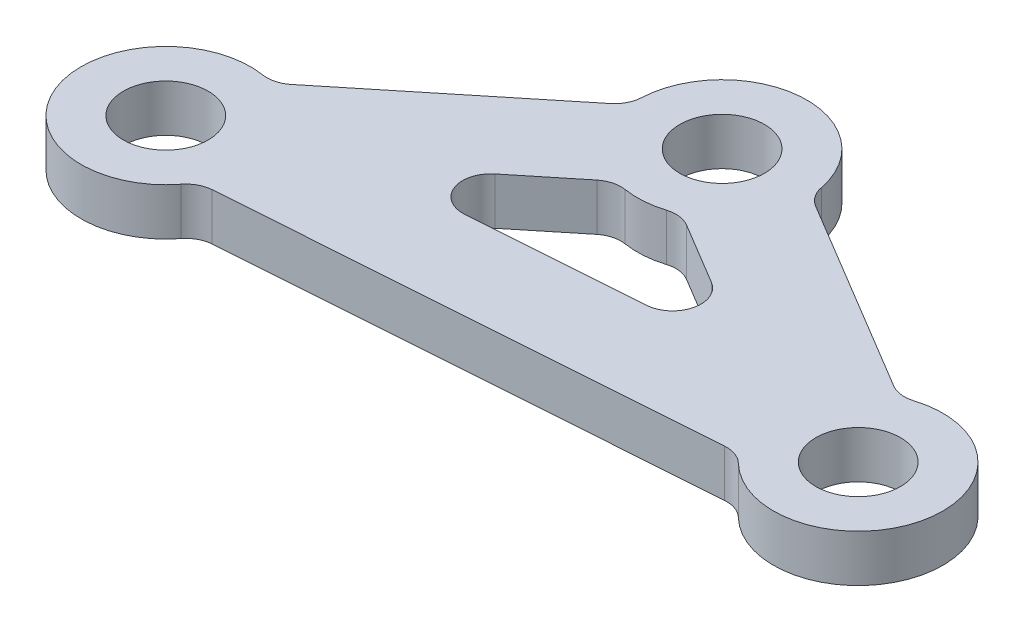
ISO-10303-21;
HEADER;
FILE_DESCRIPTION(('STEP AP214'),'2;1');
FILE_NAME('part.step','',(''),(''),'','','');
FILE_SCHEMA(('AUTOMOTIVE_DESIGN { 1 0 10303 214 1 1 1 1 }'));
ENDSEC;
DATA;
#1=APPLICATION_CONTEXT('core data for automotive mechanical design processes');
#2=APPLICATION_PROTOCOL_DEFINITION('international standard','automotive_design',2000,#1);
#3=PRODUCT_CONTEXT('',#1,'mechanical');
#4=PRODUCT('Part','Part','',(#3));
#5=PRODUCT_RELATED_PRODUCT_CATEGORY('part','',(#4));
#6=PRODUCT_DEFINITION_FORMATION('','',#4);
#7=PRODUCT_DEFINITION_CONTEXT('part definition',#1,'design');
#8=PRODUCT_DEFINITION('design','',#6,#7);
#9=PRODUCT_DEFINITION_SHAPE('','',#8);
#10=(LENGTH_UNIT() NAMED_UNIT(*) SI_UNIT(.MILLI.,.METRE.));
#11=(NAMED_UNIT(*) PLANE_ANGLE_UNIT() SI_UNIT($,.RADIAN.));
#12=(NAMED_UNIT(*) SI_UNIT($,.STERADIAN.) SOLID_ANGLE_UNIT());
#13=UNCERTAINTY_MEASURE_WITH_UNIT(LENGTH_MEASURE(1.E-05),#10,'distance_accuracy_value','');
#14=(GEOMETRIC_REPRESENTATION_CONTEXT(3) GLOBAL_UNCERTAINTY_ASSIGNED_CONTEXT((#13)) GLOBAL_UNIT_ASSIGNED_CONTEXT((#10,
#11,#12)) REPRESENTATION_CONTEXT('',''));
#15=CARTESIAN_POINT('',(0.,0.,0.));
#16=DIRECTION('',(0.,0.,1.));
#17=DIRECTION('',(1.,0.,0.));
#18=AXIS2_PLACEMENT_3D('',#15,#16,#17);
#19=CARTESIAN_POINT('',(-31.9078042505049,5.,-2.78443216297212));
#20=DIRECTION('',(0.,-1.,0.));
#21=DIRECTION('',(0.,0.,-1.));
#22=AXIS2_PLACEMENT_3D('',#19,#20,#21);
#23=PLANE('',#22);
#24=CARTESIAN_POINT('',(-1.20500587742235,5.,-17.4138317276128));
#25=DIRECTION('',(0.,1.,0.));
#26=DIRECTION('',(0.,0.,1.));
#27=AXIS2_PLACEMENT_3D('',#24,#25,#26);
#28=CIRCLE('',#27,4.5);
#29=CARTESIAN_POINT('',(-1.20500587742235,5.,-12.9138317276128));
#30=VERTEX_POINT('',#29);
#31=EDGE_CURVE('E266',#30,#30,#28,.T.);
#32=ORIENTED_EDGE('',*,*,#31,.F.);
#33=EDGE_LOOP('',(#32));
#34=FACE_BOUND('',#33,.T.);
#35=CARTESIAN_POINT('',(34.8269196362404,5.,4.16625964795513));
#36=DIRECTION('',(0.,1.,0.));
#37=DIRECTION('',(0.,0.,1.));
#38=AXIS2_PLACEMENT_3D('',#35,#36,#37);
#39=CIRCLE('',#38,4.5);
#40=CARTESIAN_POINT('',(34.8269196362404,5.,8.66625964795512));
#41=VERTEX_POINT('',#40);
#42=EDGE_CURVE('E274',#41,#41,#39,.T.);
#43=ORIENTED_EDGE('',*,*,#42,.F.);
#44=EDGE_LOOP('',(#43));
#45=FACE_BOUND('',#44,.T.);
#46=CARTESIAN_POINT('',(-33.807302827412,5.,9.06427684503074));
#47=DIRECTION('',(0.,1.,0.));
#48=DIRECTION('',(0.,0.,1.));
#49=AXIS2_PLACEMENT_3D('',#46,#47,#48);
#50=CIRCLE('',#49,4.5);
#51=CARTESIAN_POINT('',(-33.807302827412,5.,13.5642768450307));
#52=VERTEX_POINT('',#51);
#53=EDGE_CURVE('E282',#52,#52,#50,.T.);
#54=ORIENTED_EDGE('',*,*,#53,.F.);
#55=EDGE_LOOP('',(#54));
#56=FACE_BOUND('',#55,.T.);
#57=CARTESIAN_POINT('',(-31.9078042505049,5.,-2.78443216297212));
#58=DIRECTION('',(0.,-1.,0.));
#59=DIRECTION('',(0.,0.,-1.));
#60=AXIS2_PLACEMENT_3D('',#57,#58,#59);
#61=CIRCLE('',#60,3.);
#62=CARTESIAN_POINT('',(-30.0165107810304,5.,-0.455696666544289));
#63=VERTEX_POINT('',#62);
#64=CARTESIAN_POINT('',(-32.3826788947317,5.,0.177745089028594));
#65=VERTEX_POINT('',#64);
#66=EDGE_CURVE('E290',#63,#65,#61,.T.);
#67=ORIENTED_EDGE('',*,*,#66,.T.);
#68=CARTESIAN_POINT('',(-33.807302827412,5.,9.06427684503074));
#69=DIRECTION('',(0.,1.,0.));
#70=DIRECTION('',(0.,0.,1.));
#71=AXIS2_PLACEMENT_3D('',#68,#69,#70);
#72=CIRCLE('',#71,9.);
#73=CARTESIAN_POINT('',(-26.6890175859849,5.,14.5715461521993));
#74=VERTEX_POINT('',#73);
#75=EDGE_CURVE('E294',#65,#74,#72,.T.);
#76=ORIENTED_EDGE('',*,*,#75,.T.);
#77=CARTESIAN_POINT('',(-24.3162558388425,5.,16.4073025879222));
#78=DIRECTION('',(0.,-1.,0.));
#79=DIRECTION('',(0.,0.,1.));
#80=AXIS2_PLACEMENT_3D('',#77,#78,#79);
#81=CIRCLE('',#80,3.);
#82=CARTESIAN_POINT('',(-24.5298049434677,5.,13.4149127770998));
#83=VERTEX_POINT('',#82);
#84=EDGE_CURVE('E298',#74,#83,#81,.T.);
#85=ORIENTED_EDGE('',*,*,#84,.T.);
#86=DIRECTION('',(0.997463270274136,0.,-0.0711830348750776));
#87=VECTOR('',#86,1.);
#88=CARTESIAN_POINT('',(-24.5298049434677,5.,13.4149127770998));
#89=LINE('',#88,#87);
#90=CARTESIAN_POINT('',(26.2612521010469,5.,9.79025641862745));
#91=VERTEX_POINT('',#90);
#92=EDGE_CURVE('E301',#83,#91,#89,.T.);
#93=ORIENTED_EDGE('',*,*,#92,.T.);
#94=CARTESIAN_POINT('',(26.4748012056722,5.,12.7826462294499));
#95=DIRECTION('',(0.,-1.,0.));
#96=DIRECTION('',(0.,0.,-1.));
#97=AXIS2_PLACEMENT_3D('',#94,#95,#96);
#98=CIRCLE('',#97,3.);
#99=CARTESIAN_POINT('',(28.5628308133142,5.,10.6285495840762));
#100=VERTEX_POINT('',#99);
#101=EDGE_CURVE('E304',#91,#100,#98,.T.);
#102=ORIENTED_EDGE('',*,*,#101,.T.);
#103=CARTESIAN_POINT('',(34.8269196362404,5.,4.16625964795513));
#104=DIRECTION('',(0.,1.,0.));
#105=DIRECTION('',(0.,0.,1.));
#106=AXIS2_PLACEMENT_3D('',#103,#104,#105);
#107=CIRCLE('',#106,9.00000000000001);
#108=CARTESIAN_POINT('',(32.1548016321245,5.,-4.42791194517004));
#109=VERTEX_POINT('',#108);
#110=EDGE_CURVE('E307',#100,#109,#107,.T.);
#111=ORIENTED_EDGE('',*,*,#110,.T.);
#112=CARTESIAN_POINT('',(31.2640956307525,5.,-7.29263580954509));
#113=DIRECTION('',(0.,-1.,0.));
#114=DIRECTION('',(0.,0.,1.));
#115=AXIS2_PLACEMENT_3D('',#112,#113,#114);
#116=CIRCLE('',#115,3.);
#117=CARTESIAN_POINT('',(29.7226605324976,5.,-4.71892684428347));
#118=VERTEX_POINT('',#117);
#119=EDGE_CURVE('E310',#109,#118,#116,.T.);
#120=ORIENTED_EDGE('',*,*,#119,.T.);
#121=DIRECTION('',(-0.857902988420542,0.,-0.513811699418283));
#122=VECTOR('',#121,1.);
#123=CARTESIAN_POINT('',(9.03737022050325,5.,-17.1076751195796));
#124=LINE('',#123,#122);
#125=CARTESIAN_POINT('',(9.03737022050325,5.,-17.1076751195796));
#126=VERTEX_POINT('',#125);
#127=EDGE_CURVE('E313',#118,#126,#124,.T.);
#128=ORIENTED_EDGE('',*,*,#127,.T.);
#129=CARTESIAN_POINT('',(10.5788053187581,5.,-19.6813840848412));
#130=DIRECTION('',(0.,-1.,0.));
#131=DIRECTION('',(0.,0.,-1.));
#132=AXIS2_PLACEMENT_3D('',#129,#130,#131);
#133=CIRCLE('',#132,3.);
#134=CARTESIAN_POINT('',(7.63285251971299,5.,-19.1144959955341));
#135=VERTEX_POINT('',#134);
#136=EDGE_CURVE('E316',#126,#135,#133,.T.);
#137=ORIENTED_EDGE('',*,*,#136,.T.);
#138=CARTESIAN_POINT('',(-1.20500587742235,5.,-17.4138317276128));
#139=DIRECTION('',(0.,1.,0.));
#140=DIRECTION('',(0.,0.,1.));
#141=AXIS2_PLACEMENT_3D('',#138,#139,#140);
#142=CIRCLE('',#141,9.);
#143=CARTESIAN_POINT('',(-10.1948036880008,5.,-17.8422419573219));
#144=VERTEX_POINT('',#143);
#145=EDGE_CURVE('E319',#135,#144,#142,.T.);
#146=ORIENTED_EDGE('',*,*,#145,.T.);
#147=CARTESIAN_POINT('',(-13.1914029581936,5.,-17.985045367225));
#148=DIRECTION('',(0.,-1.,0.));
#149=DIRECTION('',(0.,0.,1.));
#150=AXIS2_PLACEMENT_3D('',#147,#148,#149);
#151=CIRCLE('',#150,3.);
#152=CARTESIAN_POINT('',(-11.300109488719,5.,-15.6563098707972));
#153=VERTEX_POINT('',#152);
#154=EDGE_CURVE('E322',#144,#153,#151,.T.);
#155=ORIENTED_EDGE('',*,*,#154,.T.);
#156=DIRECTION('',(-0.776245165475943,0.,0.630431156491512));
#157=VECTOR('',#156,1.);
#158=CARTESIAN_POINT('',(-11.300109488719,5.,-15.6563098707972));
#159=LINE('',#158,#157);
#160=EDGE_CURVE('E325',#153,#63,#159,.T.);
#161=ORIENTED_EDGE('',*,*,#160,.T.);
#162=EDGE_LOOP('',(#67,#76,#85,#93,#102,#111,#120,#128,#137,#146,#155,#161));
#163=FACE_BOUND('',#162,.T.);
#164=CARTESIAN_POINT('',(-9.06837251801521,5.,-0.721539264572235));
#165=DIRECTION('',(0.,1.,0.));
#166=DIRECTION('',(0.,0.,-1.));
#167=AXIS2_PLACEMENT_3D('',#164,#165,#166);
#168=CIRCLE('',#167,3.);
#169=CARTESIAN_POINT('',(-10.9596659874897,5.,-3.05027476100014));
#170=VERTEX_POINT('',#169);
#171=CARTESIAN_POINT('',(-8.85482341338986,5.,2.27085054625017));
#172=VERTEX_POINT('',#171);
#173=EDGE_CURVE('E177',#170,#172,#168,.T.);
#174=ORIENTED_EDGE('',*,*,#173,.F.);
#175=DIRECTION('',(-0.776245165475943,0.,0.630431156491512));
#176=VECTOR('',#175,1.);
#177=CARTESIAN_POINT('',(-4.99579792380391,5.,-7.89385821603773));
#178=LINE('',#177,#176);
#179=CARTESIAN_POINT('',(-4.99579792380391,5.,-7.89385821603772));
#180=VERTEX_POINT('',#179);
#181=EDGE_CURVE('E218',#180,#170,#178,.T.);
#182=ORIENTED_EDGE('',*,*,#181,.F.);
#183=CARTESIAN_POINT('',(-3.10450445432938,5.,-5.5651227196099));
#184=DIRECTION('',(0.,1.,0.));
#185=DIRECTION('',(0.,0.,-1.));
#186=AXIS2_PLACEMENT_3D('',#183,#184,#185);
#187=CIRCLE('',#186,3.);
#188=CARTESIAN_POINT('',(-2.62962981010262,5.,-8.52729997161062));
#189=VERTEX_POINT('',#188);
#190=EDGE_CURVE('E215',#189,#180,#187,.T.);
#191=ORIENTED_EDGE('',*,*,#190,.F.);
#192=CARTESIAN_POINT('',(-1.20500587742235,5.,-17.4138317276128));
#193=DIRECTION('',(0.,-1.,0.));
#194=DIRECTION('',(0.,0.,1.));
#195=AXIS2_PLACEMENT_3D('',#192,#193,#194);
#196=CIRCLE('',#195,9.);
#197=CARTESIAN_POINT('',(1.4671121266936,5.,-8.8196601344876));
#198=VERTEX_POINT('',#197);
#199=EDGE_CURVE('E212',#198,#189,#196,.T.);
#200=ORIENTED_EDGE('',*,*,#199,.F.);
#201=CARTESIAN_POINT('',(2.35781812806558,5.,-5.95493627011255));
#202=DIRECTION('',(0.,1.,0.));
#203=DIRECTION('',(0.,0.,1.));
#204=AXIS2_PLACEMENT_3D('',#201,#202,#203);
#205=CIRCLE('',#204,3.);
#206=CARTESIAN_POINT('',(3.89925322632043,5.,-8.52864523537417));
#207=VERTEX_POINT('',#206);
#208=EDGE_CURVE('E209',#207,#198,#205,.T.);
#209=ORIENTED_EDGE('',*,*,#208,.F.);
#210=DIRECTION('',(-0.857902988420542,0.,-0.513811699418283));
#211=VECTOR('',#210,1.);
#212=CARTESIAN_POINT('',(3.89925322632043,5.,-8.52864523537417));
#213=LINE('',#212,#211);
#214=CARTESIAN_POINT('',(10.4904958670972,5.,-4.58104553208976));
#215=VERTEX_POINT('',#214);
#216=EDGE_CURVE('E204',#215,#207,#213,.T.);
#217=ORIENTED_EDGE('',*,*,#216,.F.);
#218=CARTESIAN_POINT('',(8.9490607688424,5.,-2.00733656682807));
#219=DIRECTION('',(0.,1.,0.));
#220=DIRECTION('',(0.,0.,1.));
#221=AXIS2_PLACEMENT_3D('',#218,#219,#220);
#222=CIRCLE('',#221,3.);
#223=CARTESIAN_POINT('',(9.16260987346752,5.,0.985053243994346));
#224=VERTEX_POINT('',#223);
#225=EDGE_CURVE('E200',#224,#215,#222,.T.);
#226=ORIENTED_EDGE('',*,*,#225,.F.);
#227=DIRECTION('',(0.997463270274136,0.,-0.0711830348750775));
#228=VECTOR('',#227,1.);
#229=CARTESIAN_POINT('',(-8.85482341338986,5.,2.27085054625017));
#230=LINE('',#229,#228);
#231=EDGE_CURVE('E186',#172,#224,#230,.T.);
#232=ORIENTED_EDGE('',*,*,#231,.F.);
#233=EDGE_LOOP('',(#174,#182,#191,#200,#209,#217,#226,#232));
#234=FACE_BOUND('',#233,.T.);
#235=ADVANCED_FACE('F39',(#34,#45,#56,#163,#234),#23,.F.);
#236=CARTESIAN_POINT('',(-31.9078042505049,0.,-2.78443216297212));
#237=DIRECTION('',(0.,-1.,0.));
#238=DIRECTION('',(0.,0.,-1.));
#239=AXIS2_PLACEMENT_3D('',#236,#237,#238);
#240=PLANE('',#239);
#241=CARTESIAN_POINT('',(34.8269196362404,0.,4.16625964795513));
#242=DIRECTION('',(0.,1.,0.));
#243=DIRECTION('',(0.,0.,1.));
#244=AXIS2_PLACEMENT_3D('',#241,#242,#243);
#245=CIRCLE('',#244,4.5);
#246=CARTESIAN_POINT('',(34.8269196362404,0.,8.66625964795512));
#247=VERTEX_POINT('',#246);
#248=EDGE_CURVE('E270',#247,#247,#245,.T.);
#249=ORIENTED_EDGE('',*,*,#248,.T.);
#250=EDGE_LOOP('',(#249));
#251=FACE_BOUND('',#250,.T.);
#252=CARTESIAN_POINT('',(-31.9078042505049,0.,-2.78443216297212));
#253=DIRECTION('',(0.,-1.,0.));
#254=DIRECTION('',(0.,0.,-1.));
#255=AXIS2_PLACEMENT_3D('',#252,#253,#254);
#256=CIRCLE('',#255,3.);
#257=CARTESIAN_POINT('',(-30.0165107810304,0.,-0.455696666544289));
#258=VERTEX_POINT('',#257);
#259=CARTESIAN_POINT('',(-32.3826788947317,0.,0.177745089028594));
#260=VERTEX_POINT('',#259);
#261=EDGE_CURVE('E286',#258,#260,#256,.T.);
#262=ORIENTED_EDGE('',*,*,#261,.F.);
#263=DIRECTION('',(-0.776245165475943,0.,0.630431156491512));
#264=VECTOR('',#263,1.);
#265=CARTESIAN_POINT('',(-11.300109488719,0.,-15.6563098707972));
#266=LINE('',#265,#264);
#267=CARTESIAN_POINT('',(-11.300109488719,0.,-15.6563098707972));
#268=VERTEX_POINT('',#267);
#269=EDGE_CURVE('E295',#268,#258,#266,.T.);
#270=ORIENTED_EDGE('',*,*,#269,.F.);
#271=CARTESIAN_POINT('',(-13.1914029581936,0.,-17.985045367225));
#272=DIRECTION('',(0.,-1.,0.));
#273=DIRECTION('',(0.,0.,1.));
#274=AXIS2_PLACEMENT_3D('',#271,#272,#273);
#275=CIRCLE('',#274,3.);
#276=CARTESIAN_POINT('',(-10.1948036880008,0.,-17.8422419573219));
#277=VERTEX_POINT('',#276);
#278=EDGE_CURVE('E359',#277,#268,#275,.T.);
#279=ORIENTED_EDGE('',*,*,#278,.F.);
#280=CARTESIAN_POINT('',(-1.20500587742235,0.,-17.4138317276128));
#281=DIRECTION('',(0.,1.,0.));
#282=DIRECTION('',(0.,0.,1.));
#283=AXIS2_PLACEMENT_3D('',#280,#281,#282);
#284=CIRCLE('',#283,9.);
#285=CARTESIAN_POINT('',(7.63285251971299,0.,-19.1144959955341));
#286=VERTEX_POINT('',#285);
#287=EDGE_CURVE('E356',#286,#277,#284,.T.);
#288=ORIENTED_EDGE('',*,*,#287,.F.);
#289=CARTESIAN_POINT('',(10.5788053187581,0.,-19.6813840848412));
#290=DIRECTION('',(0.,-1.,0.));
#291=DIRECTION('',(0.,0.,-1.));
#292=AXIS2_PLACEMENT_3D('',#289,#290,#291);
#293=CIRCLE('',#292,3.);
#294=CARTESIAN_POINT('',(9.03737022050325,0.,-17.1076751195796));
#295=VERTEX_POINT('',#294);
#296=EDGE_CURVE('E353',#295,#286,#293,.T.);
#297=ORIENTED_EDGE('',*,*,#296,.F.);
#298=DIRECTION('',(-0.857902988420542,0.,-0.513811699418283));
#299=VECTOR('',#298,1.);
#300=CARTESIAN_POINT('',(9.03737022050325,0.,-17.1076751195796));
#301=LINE('',#300,#299);
#302=CARTESIAN_POINT('',(29.7226605324976,0.,-4.71892684428347));
#303=VERTEX_POINT('',#302);
#304=EDGE_CURVE('E350',#303,#295,#301,.T.);
#305=ORIENTED_EDGE('',*,*,#304,.F.);
#306=CARTESIAN_POINT('',(31.2640956307525,0.,-7.29263580954509));
#307=DIRECTION('',(0.,-1.,0.));
#308=DIRECTION('',(0.,0.,1.));
#309=AXIS2_PLACEMENT_3D('',#306,#307,#308);
#310=CIRCLE('',#309,3.);
#311=CARTESIAN_POINT('',(32.1548016321245,0.,-4.42791194517004));
#312=VERTEX_POINT('',#311);
#313=EDGE_CURVE('E347',#312,#303,#310,.T.);
#314=ORIENTED_EDGE('',*,*,#313,.F.);
#315=CARTESIAN_POINT('',(34.8269196362404,0.,4.16625964795513));
#316=DIRECTION('',(0.,1.,0.));
#317=DIRECTION('',(0.,0.,1.));
#318=AXIS2_PLACEMENT_3D('',#315,#316,#317);
#319=CIRCLE('',#318,9.00000000000001);
#320=CARTESIAN_POINT('',(28.5628308133142,0.,10.6285495840762));
#321=VERTEX_POINT('',#320);
#322=EDGE_CURVE('E344',#321,#312,#319,.T.);
#323=ORIENTED_EDGE('',*,*,#322,.F.);
#324=CARTESIAN_POINT('',(26.4748012056722,0.,12.7826462294499));
#325=DIRECTION('',(0.,-1.,0.));
#326=DIRECTION('',(0.,0.,-1.));
#327=AXIS2_PLACEMENT_3D('',#324,#325,#326);
#328=CIRCLE('',#327,3.);
#329=CARTESIAN_POINT('',(26.2612521010469,0.,9.79025641862745));
#330=VERTEX_POINT('',#329);
#331=EDGE_CURVE('E341',#330,#321,#328,.T.);
#332=ORIENTED_EDGE('',*,*,#331,.F.);
#333=DIRECTION('',(0.997463270274136,0.,-0.0711830348750776));
#334=VECTOR('',#333,1.);
#335=CARTESIAN_POINT('',(-24.5298049434677,0.,13.4149127770998));
#336=LINE('',#335,#334);
#337=CARTESIAN_POINT('',(-24.5298049434677,0.,13.4149127770998));
#338=VERTEX_POINT('',#337);
#339=EDGE_CURVE('E338',#338,#330,#336,.T.);
#340=ORIENTED_EDGE('',*,*,#339,.F.);
#341=CARTESIAN_POINT('',(-24.3162558388425,0.,16.4073025879222));
#342=DIRECTION('',(0.,-1.,0.));
#343=DIRECTION('',(0.,0.,1.));
#344=AXIS2_PLACEMENT_3D('',#341,#342,#343);
#345=CIRCLE('',#344,3.);
#346=CARTESIAN_POINT('',(-26.6890175859849,0.,14.5715461521993));
#347=VERTEX_POINT('',#346);
#348=EDGE_CURVE('E335',#347,#338,#345,.T.);
#349=ORIENTED_EDGE('',*,*,#348,.F.);
#350=CARTESIAN_POINT('',(-33.807302827412,0.,9.06427684503074));
#351=DIRECTION('',(0.,1.,0.));
#352=DIRECTION('',(0.,0.,1.));
#353=AXIS2_PLACEMENT_3D('',#350,#351,#352);
#354=CIRCLE('',#353,9.);
#355=EDGE_CURVE('E332',#260,#347,#354,.T.);
#356=ORIENTED_EDGE('',*,*,#355,.F.);
#357=EDGE_LOOP('',(#262,#270,#279,#288,#297,#305,#314,#323,#332,#340,#349,#356));
#358=FACE_BOUND('',#357,.T.);
#359=CARTESIAN_POINT('',(-33.807302827412,0.,9.06427684503074));
#360=DIRECTION('',(0.,1.,0.));
#361=DIRECTION('',(0.,0.,1.));
#362=AXIS2_PLACEMENT_3D('',#359,#360,#361);
#363=CIRCLE('',#362,4.5);
#364=CARTESIAN_POINT('',(-33.807302827412,0.,13.5642768450307));
#365=VERTEX_POINT('',#364);
#366=EDGE_CURVE('E278',#365,#365,#363,.T.);
#367=ORIENTED_EDGE('',*,*,#366,.T.);
#368=EDGE_LOOP('',(#367));
#369=FACE_BOUND('',#368,.T.);
#370=CARTESIAN_POINT('',(-1.20500587742235,0.,-17.4138317276128));
#371=DIRECTION('',(0.,1.,0.));
#372=DIRECTION('',(0.,0.,1.));
#373=AXIS2_PLACEMENT_3D('',#370,#371,#372);
#374=CIRCLE('',#373,4.5);
#375=CARTESIAN_POINT('',(-1.20500587742235,0.,-12.9138317276128));
#376=VERTEX_POINT('',#375);
#377=EDGE_CURVE('E195',#376,#376,#374,.T.);
#378=ORIENTED_EDGE('',*,*,#377,.T.);
#379=EDGE_LOOP('',(#378));
#380=FACE_BOUND('',#379,.T.);
#381=DIRECTION('',(-0.776245165475943,0.,0.630431156491512));
#382=VECTOR('',#381,1.);
#383=CARTESIAN_POINT('',(-4.99579792380391,0.,-7.89385821603773));
#384=LINE('',#383,#382);
#385=CARTESIAN_POINT('',(-4.99579792380391,0.,-7.89385821603773));
#386=VERTEX_POINT('',#385);
#387=CARTESIAN_POINT('',(-10.9596659874897,0.,-3.05027476100014));
#388=VERTEX_POINT('',#387);
#389=EDGE_CURVE('E187',#386,#388,#384,.T.);
#390=ORIENTED_EDGE('',*,*,#389,.T.);
#391=CARTESIAN_POINT('',(-9.06837251801521,0.,-0.721539264572235));
#392=DIRECTION('',(0.,1.,0.));
#393=DIRECTION('',(0.,0.,-1.));
#394=AXIS2_PLACEMENT_3D('',#391,#392,#393);
#395=CIRCLE('',#394,3.);
#396=CARTESIAN_POINT('',(-8.85482341338986,0.,2.27085054625017));
#397=VERTEX_POINT('',#396);
#398=EDGE_CURVE('E63',#388,#397,#395,.T.);
#399=ORIENTED_EDGE('',*,*,#398,.T.);
#400=DIRECTION('',(0.997463270274136,0.,-0.0711830348750775));
#401=VECTOR('',#400,1.);
#402=CARTESIAN_POINT('',(-8.85482341338986,0.,2.27085054625017));
#403=LINE('',#402,#401);
#404=CARTESIAN_POINT('',(9.16260987346752,0.,0.985053243994346));
#405=VERTEX_POINT('',#404);
#406=EDGE_CURVE('E193',#397,#405,#403,.T.);
#407=ORIENTED_EDGE('',*,*,#406,.T.);
#408=CARTESIAN_POINT('',(8.9490607688424,0.,-2.00733656682807));
#409=DIRECTION('',(0.,1.,0.));
#410=DIRECTION('',(0.,0.,1.));
#411=AXIS2_PLACEMENT_3D('',#408,#409,#410);
#412=CIRCLE('',#411,3.);
#413=CARTESIAN_POINT('',(10.4904958670972,0.,-4.58104553208976));
#414=VERTEX_POINT('',#413);
#415=EDGE_CURVE('E225',#405,#414,#412,.T.);
#416=ORIENTED_EDGE('',*,*,#415,.T.);
#417=DIRECTION('',(-0.857902988420542,0.,-0.513811699418283));
#418=VECTOR('',#417,1.);
#419=CARTESIAN_POINT('',(3.89925322632043,0.,-8.52864523537417));
#420=LINE('',#419,#418);
#421=CARTESIAN_POINT('',(3.89925322632043,0.,-8.52864523537417));
#422=VERTEX_POINT('',#421);
#423=EDGE_CURVE('E229',#414,#422,#420,.T.);
#424=ORIENTED_EDGE('',*,*,#423,.T.);
#425=CARTESIAN_POINT('',(2.35781812806558,0.,-5.95493627011255));
#426=DIRECTION('',(0.,1.,0.));
#427=DIRECTION('',(0.,0.,1.));
#428=AXIS2_PLACEMENT_3D('',#425,#426,#427);
#429=CIRCLE('',#428,3.);
#430=CARTESIAN_POINT('',(1.4671121266936,0.,-8.8196601344876));
#431=VERTEX_POINT('',#430);
#432=EDGE_CURVE('E233',#422,#431,#429,.T.);
#433=ORIENTED_EDGE('',*,*,#432,.T.);
#434=CARTESIAN_POINT('',(-1.20500587742235,0.,-17.4138317276128));
#435=DIRECTION('',(0.,-1.,0.));
#436=DIRECTION('',(0.,0.,1.));
#437=AXIS2_PLACEMENT_3D('',#434,#435,#436);
#438=CIRCLE('',#437,9.);
#439=CARTESIAN_POINT('',(-2.62962981010262,0.,-8.52729997161062));
#440=VERTEX_POINT('',#439);
#441=EDGE_CURVE('E237',#431,#440,#438,.T.);
#442=ORIENTED_EDGE('',*,*,#441,.T.);
#443=CARTESIAN_POINT('',(-3.10450445432938,0.,-5.5651227196099));
#444=DIRECTION('',(0.,1.,0.));
#445=DIRECTION('',(0.,0.,-1.));
#446=AXIS2_PLACEMENT_3D('',#443,#444,#445);
#447=CIRCLE('',#446,3.);
#448=EDGE_CURVE('E241',#440,#386,#447,.T.);
#449=ORIENTED_EDGE('',*,*,#448,.T.);
#450=EDGE_LOOP('',(#390,#399,#407,#416,#424,#433,#442,#449));
#451=FACE_BOUND('',#450,.T.);
#452=ADVANCED_FACE('F414',(#251,#358,#369,#380,#451),#240,.T.);
#453=CARTESIAN_POINT('',(-31.9078042505049,5.,-2.78443216297212));
#454=DIRECTION('',(0.,-1.,0.));
#455=DIRECTION('',(0.,0.,-1.));
#456=AXIS2_PLACEMENT_3D('',#453,#454,#455);
#457=CYLINDRICAL_SURFACE('',#456,3.);
#458=ORIENTED_EDGE('',*,*,#261,.T.);
#459=DIRECTION('',(0.,-1.,0.));
#460=VECTOR('',#459,1.);
#461=CARTESIAN_POINT('',(-32.3826788947317,5.,0.177745089028594));
#462=LINE('',#461,#460);
#463=EDGE_CURVE('E11',#65,#260,#462,.T.);
#464=ORIENTED_EDGE('',*,*,#463,.F.);
#465=ORIENTED_EDGE('',*,*,#66,.F.);
#466=DIRECTION('',(0.,-1.,0.));
#467=VECTOR('',#466,1.);
#468=CARTESIAN_POINT('',(-30.0165107810304,5.,-0.455696666544289));
#469=LINE('',#468,#467);
#470=EDGE_CURVE('E328',#63,#258,#469,.T.);
#471=ORIENTED_EDGE('',*,*,#470,.T.);
#472=EDGE_LOOP('',(#458,#464,#465,#471));
#473=FACE_BOUND('',#472,.T.);
#474=ADVANCED_FACE('F41',(#473),#457,.F.);
#475=CARTESIAN_POINT('',(-33.807302827412,5.,9.06427684503074));
#476=DIRECTION('',(0.,-1.,0.));
#477=DIRECTION('',(0.,0.,-1.));
#478=AXIS2_PLACEMENT_3D('',#475,#476,#477);
#479=CYLINDRICAL_SURFACE('',#478,9.);
#480=ORIENTED_EDGE('',*,*,#355,.T.);
#481=DIRECTION('',(0.,-1.,0.));
#482=VECTOR('',#481,1.);
#483=CARTESIAN_POINT('',(-26.6890175859849,5.,14.5715461521993));
#484=LINE('',#483,#482);
#485=EDGE_CURVE('E48',#74,#347,#484,.T.);
#486=ORIENTED_EDGE('',*,*,#485,.F.);
#487=ORIENTED_EDGE('',*,*,#75,.F.);
#488=ORIENTED_EDGE('',*,*,#463,.T.);
#489=EDGE_LOOP('',(#480,#486,#487,#488));
#490=FACE_BOUND('',#489,.T.);
#491=ADVANCED_FACE('F431',(#490),#479,.T.);
#492=CARTESIAN_POINT('',(-24.3162558388425,5.,16.4073025879222));
#493=DIRECTION('',(0.,-1.,0.));
#494=DIRECTION('',(0.,0.,-1.));
#495=AXIS2_PLACEMENT_3D('',#492,#493,#494);
#496=CYLINDRICAL_SURFACE('',#495,3.);
#497=ORIENTED_EDGE('',*,*,#348,.T.);
#498=DIRECTION('',(0.,-1.,0.));
#499=VECTOR('',#498,1.);
#500=CARTESIAN_POINT('',(-24.5298049434677,5.,13.4149127770998));
#501=LINE('',#500,#499);
#502=EDGE_CURVE('E399',#83,#338,#501,.T.);
#503=ORIENTED_EDGE('',*,*,#502,.F.);
#504=ORIENTED_EDGE('',*,*,#84,.F.);
#505=ORIENTED_EDGE('',*,*,#485,.T.);
#506=EDGE_LOOP('',(#497,#503,#504,#505));
#507=FACE_BOUND('',#506,.T.);
#508=ADVANCED_FACE('F408',(#507),#496,.F.);
#509=CARTESIAN_POINT('',(-24.5298049434677,5.,13.4149127770998));
#510=DIRECTION('',(-0.0711830348750776,0.,-0.997463270274136));
#511=DIRECTION('',(-0.997463270274136,0.,0.0711830348750776));
#512=AXIS2_PLACEMENT_3D('',#509,#510,#511);
#513=PLANE('',#512);
#514=ORIENTED_EDGE('',*,*,#339,.T.);
#515=DIRECTION('',(0.,-1.,0.));
#516=VECTOR('',#515,1.);
#517=CARTESIAN_POINT('',(26.2612521010469,5.,9.79025641862745));
#518=LINE('',#517,#516);
#519=EDGE_CURVE('E395',#91,#330,#518,.T.);
#520=ORIENTED_EDGE('',*,*,#519,.F.);
#521=ORIENTED_EDGE('',*,*,#92,.F.);
#522=ORIENTED_EDGE('',*,*,#502,.T.);
#523=EDGE_LOOP('',(#514,#520,#521,#522));
#524=FACE_BOUND('',#523,.T.);
#525=ADVANCED_FACE('F420',(#524),#513,.F.);
#526=CARTESIAN_POINT('',(26.4748012056722,5.,12.7826462294499));
#527=DIRECTION('',(0.,-1.,0.));
#528=DIRECTION('',(0.,0.,-1.));
#529=AXIS2_PLACEMENT_3D('',#526,#527,#528);
#530=CYLINDRICAL_SURFACE('',#529,3.);
#531=ORIENTED_EDGE('',*,*,#331,.T.);
#532=DIRECTION('',(0.,-1.,0.));
#533=VECTOR('',#532,1.);
#534=CARTESIAN_POINT('',(28.5628308133142,5.,10.6285495840762));
#535=LINE('',#534,#533);
#536=EDGE_CURVE('E391',#100,#321,#535,.T.);
#537=ORIENTED_EDGE('',*,*,#536,.F.);
#538=ORIENTED_EDGE('',*,*,#101,.F.);
#539=ORIENTED_EDGE('',*,*,#519,.T.);
#540=EDGE_LOOP('',(#531,#537,#538,#539));
#541=FACE_BOUND('',#540,.T.);
#542=ADVANCED_FACE('F424',(#541),#530,.F.);
#543=CARTESIAN_POINT('',(34.8269196362404,5.,4.16625964795513));
#544=DIRECTION('',(0.,-1.,0.));
#545=DIRECTION('',(0.,0.,-1.));
#546=AXIS2_PLACEMENT_3D('',#543,#544,#545);
#547=CYLINDRICAL_SURFACE('',#546,9.00000000000001);
#548=ORIENTED_EDGE('',*,*,#322,.T.);
#549=DIRECTION('',(0.,-1.,0.));
#550=VECTOR('',#549,1.);
#551=CARTESIAN_POINT('',(32.1548016321245,5.,-4.42791194517004));
#552=LINE('',#551,#550);
#553=EDGE_CURVE('E387',#109,#312,#552,.T.);
#554=ORIENTED_EDGE('',*,*,#553,.F.);
#555=ORIENTED_EDGE('',*,*,#110,.F.);
#556=ORIENTED_EDGE('',*,*,#536,.T.);
#557=EDGE_LOOP('',(#548,#554,#555,#556));
#558=FACE_BOUND('',#557,.T.);
#559=ADVANCED_FACE('F464',(#558),#547,.T.);
#560=CARTESIAN_POINT('',(31.2640956307525,5.,-7.29263580954509));
#561=DIRECTION('',(0.,-1.,0.));
#562=DIRECTION('',(0.,0.,-1.));
#563=AXIS2_PLACEMENT_3D('',#560,#561,#562);
#564=CYLINDRICAL_SURFACE('',#563,3.);
#565=ORIENTED_EDGE('',*,*,#313,.T.);
#566=DIRECTION('',(0.,-1.,0.));
#567=VECTOR('',#566,1.);
#568=CARTESIAN_POINT('',(29.7226605324976,5.,-4.71892684428347));
#569=LINE('',#568,#567);
#570=EDGE_CURVE('E383',#118,#303,#569,.T.);
#571=ORIENTED_EDGE('',*,*,#570,.F.);
#572=ORIENTED_EDGE('',*,*,#119,.F.);
#573=ORIENTED_EDGE('',*,*,#553,.T.);
#574=EDGE_LOOP('',(#565,#571,#572,#573));
#575=FACE_BOUND('',#574,.T.);
#576=ADVANCED_FACE('F462',(#575),#564,.F.);
#577=CARTESIAN_POINT('',(9.03737022050325,5.,-17.1076751195796));
#578=DIRECTION('',(-0.513811699418283,0.,0.857902988420542));
#579=DIRECTION('',(0.857902988420542,0.,0.513811699418283));
#580=AXIS2_PLACEMENT_3D('',#577,#578,#579);
#581=PLANE('',#580);
#582=ORIENTED_EDGE('',*,*,#304,.T.);
#583=DIRECTION('',(0.,-1.,0.));
#584=VECTOR('',#583,1.);
#585=CARTESIAN_POINT('',(9.03737022050325,5.,-17.1076751195796));
#586=LINE('',#585,#584);
#587=EDGE_CURVE('E379',#126,#295,#586,.T.);
#588=ORIENTED_EDGE('',*,*,#587,.F.);
#589=ORIENTED_EDGE('',*,*,#127,.F.);
#590=ORIENTED_EDGE('',*,*,#570,.T.);
#591=EDGE_LOOP('',(#582,#588,#589,#590));
#592=FACE_BOUND('',#591,.T.);
#593=ADVANCED_FACE('F458',(#592),#581,.F.);
#594=CARTESIAN_POINT('',(10.5788053187581,5.,-19.6813840848412));
#595=DIRECTION('',(0.,-1.,0.));
#596=DIRECTION('',(0.,0.,-1.));
#597=AXIS2_PLACEMENT_3D('',#594,#595,#596);
#598=CYLINDRICAL_SURFACE('',#597,3.);
#599=ORIENTED_EDGE('',*,*,#296,.T.);
#600=DIRECTION('',(0.,-1.,0.));
#601=VECTOR('',#600,1.);
#602=CARTESIAN_POINT('',(7.63285251971299,5.,-19.1144959955341));
#603=LINE('',#602,#601);
#604=EDGE_CURVE('E375',#135,#286,#603,.T.);
#605=ORIENTED_EDGE('',*,*,#604,.F.);
#606=ORIENTED_EDGE('',*,*,#136,.F.);
#607=ORIENTED_EDGE('',*,*,#587,.T.);
#608=EDGE_LOOP('',(#599,#605,#606,#607));
#609=FACE_BOUND('',#608,.T.);
#610=ADVANCED_FACE('F453',(#609),#598,.F.);
#611=CARTESIAN_POINT('',(-1.20500587742235,5.,-17.4138317276128));
#612=DIRECTION('',(0.,-1.,0.));
#613=DIRECTION('',(0.,0.,-1.));
#614=AXIS2_PLACEMENT_3D('',#611,#612,#613);
#615=CYLINDRICAL_SURFACE('',#614,9.);
#616=ORIENTED_EDGE('',*,*,#287,.T.);
#617=DIRECTION('',(0.,-1.,0.));
#618=VECTOR('',#617,1.);
#619=CARTESIAN_POINT('',(-10.1948036880008,5.,-17.8422419573219));
#620=LINE('',#619,#618);
#621=EDGE_CURVE('E371',#144,#277,#620,.T.);
#622=ORIENTED_EDGE('',*,*,#621,.F.);
#623=ORIENTED_EDGE('',*,*,#145,.F.);
#624=ORIENTED_EDGE('',*,*,#604,.T.);
#625=EDGE_LOOP('',(#616,#622,#623,#624));
#626=FACE_BOUND('',#625,.T.);
#627=ADVANCED_FACE('F447',(#626),#615,.T.);
#628=CARTESIAN_POINT('',(-13.1914029581936,5.,-17.985045367225));
#629=DIRECTION('',(0.,-1.,0.));
#630=DIRECTION('',(0.,0.,-1.));
#631=AXIS2_PLACEMENT_3D('',#628,#629,#630);
#632=CYLINDRICAL_SURFACE('',#631,3.);
#633=ORIENTED_EDGE('',*,*,#278,.T.);
#634=DIRECTION('',(0.,-1.,0.));
#635=VECTOR('',#634,1.);
#636=CARTESIAN_POINT('',(-11.300109488719,5.,-15.6563098707972));
#637=LINE('',#636,#635);
#638=EDGE_CURVE('E367',#153,#268,#637,.T.);
#639=ORIENTED_EDGE('',*,*,#638,.F.);
#640=ORIENTED_EDGE('',*,*,#154,.F.);
#641=ORIENTED_EDGE('',*,*,#621,.T.);
#642=EDGE_LOOP('',(#633,#639,#640,#641));
#643=FACE_BOUND('',#642,.T.);
#644=ADVANCED_FACE('F443',(#643),#632,.F.);
#645=CARTESIAN_POINT('',(-11.300109488719,5.,-15.6563098707972));
#646=DIRECTION('',(0.630431156491512,0.,0.776245165475943));
#647=DIRECTION('',(0.776245165475943,0.,-0.630431156491512));
#648=AXIS2_PLACEMENT_3D('',#645,#646,#647);
#649=PLANE('',#648);
#650=ORIENTED_EDGE('',*,*,#269,.T.);
#651=ORIENTED_EDGE('',*,*,#470,.F.);
#652=ORIENTED_EDGE('',*,*,#160,.F.);
#653=ORIENTED_EDGE('',*,*,#638,.T.);
#654=EDGE_LOOP('',(#650,#651,#652,#653));
#655=FACE_BOUND('',#654,.T.);
#656=ADVANCED_FACE('F438',(#655),#649,.F.);
#657=CARTESIAN_POINT('',(-33.807302827412,5.,9.06427684503074));
#658=DIRECTION('',(0.,-1.,0.));
#659=DIRECTION('',(0.,0.,-1.));
#660=AXIS2_PLACEMENT_3D('',#657,#658,#659);
#661=CYLINDRICAL_SURFACE('',#660,4.5);
#662=ORIENTED_EDGE('',*,*,#53,.T.);
#663=EDGE_LOOP('',(#662));
#664=FACE_BOUND('',#663,.T.);
#665=ORIENTED_EDGE('',*,*,#366,.F.);
#666=EDGE_LOOP('',(#665));
#667=FACE_BOUND('',#666,.T.);
#668=ADVANCED_FACE('F484',(#664,#667),#661,.F.);
#669=CARTESIAN_POINT('',(34.8269196362404,5.,4.16625964795513));
#670=DIRECTION('',(0.,-1.,0.));
#671=DIRECTION('',(0.,0.,-1.));
#672=AXIS2_PLACEMENT_3D('',#669,#670,#671);
#673=CYLINDRICAL_SURFACE('',#672,4.5);
#674=ORIENTED_EDGE('',*,*,#42,.T.);
#675=EDGE_LOOP('',(#674));
#676=FACE_BOUND('',#675,.T.);
#677=ORIENTED_EDGE('',*,*,#248,.F.);
#678=EDGE_LOOP('',(#677));
#679=FACE_BOUND('',#678,.T.);
#680=ADVANCED_FACE('F522',(#676,#679),#673,.F.);
#681=CARTESIAN_POINT('',(-1.20500587742235,5.,-17.4138317276128));
#682=DIRECTION('',(0.,-1.,0.));
#683=DIRECTION('',(0.,0.,-1.));
#684=AXIS2_PLACEMENT_3D('',#681,#682,#683);
#685=CYLINDRICAL_SURFACE('',#684,4.5);
#686=ORIENTED_EDGE('',*,*,#31,.T.);
#687=EDGE_LOOP('',(#686));
#688=FACE_BOUND('',#687,.T.);
#689=ORIENTED_EDGE('',*,*,#377,.F.);
#690=EDGE_LOOP('',(#689));
#691=FACE_BOUND('',#690,.T.);
#692=ADVANCED_FACE('F529',(#688,#691),#685,.F.);
#693=CARTESIAN_POINT('',(-9.06837251801521,5.,-0.721539264572235));
#694=DIRECTION('',(0.,-1.,0.));
#695=DIRECTION('',(0.,0.,-1.));
#696=AXIS2_PLACEMENT_3D('',#693,#694,#695);
#697=CYLINDRICAL_SURFACE('',#696,3.);
#698=ORIENTED_EDGE('',*,*,#398,.F.);
#699=DIRECTION('',(0.,-1.,0.));
#700=VECTOR('',#699,1.);
#701=CARTESIAN_POINT('',(-10.9596659874897,5.,-3.05027476100014));
#702=LINE('',#701,#700);
#703=EDGE_CURVE('E181',#170,#388,#702,.T.);
#704=ORIENTED_EDGE('',*,*,#703,.F.);
#705=ORIENTED_EDGE('',*,*,#173,.T.);
#706=DIRECTION('',(0.,-1.,0.));
#707=VECTOR('',#706,1.);
#708=CARTESIAN_POINT('',(-8.85482341338986,5.,2.27085054625017));
#709=LINE('',#708,#707);
#710=EDGE_CURVE('E180',#172,#397,#709,.T.);
#711=ORIENTED_EDGE('',*,*,#710,.T.);
#712=EDGE_LOOP('',(#698,#704,#705,#711));
#713=FACE_BOUND('',#712,.T.);
#714=ADVANCED_FACE('F179',(#713),#697,.F.);
#715=CARTESIAN_POINT('',(-8.85482341338986,5.,2.27085054625017));
#716=DIRECTION('',(-0.0711830348750775,0.,-0.997463270274136));
#717=DIRECTION('',(-0.997463270274136,0.,0.0711830348750775));
#718=AXIS2_PLACEMENT_3D('',#715,#716,#717);
#719=PLANE('',#718);
#720=ORIENTED_EDGE('',*,*,#406,.F.);
#721=ORIENTED_EDGE('',*,*,#710,.F.);
#722=ORIENTED_EDGE('',*,*,#231,.T.);
#723=DIRECTION('',(0.,-1.,0.));
#724=VECTOR('',#723,1.);
#725=CARTESIAN_POINT('',(9.16260987346752,5.,0.985053243994346));
#726=LINE('',#725,#724);
#727=EDGE_CURVE('E196',#224,#405,#726,.T.);
#728=ORIENTED_EDGE('',*,*,#727,.T.);
#729=EDGE_LOOP('',(#720,#721,#722,#728));
#730=FACE_BOUND('',#729,.T.);
#731=ADVANCED_FACE('F190',(#730),#719,.T.);
#732=CARTESIAN_POINT('',(8.9490607688424,5.,-2.00733656682807));
#733=DIRECTION('',(0.,-1.,0.));
#734=DIRECTION('',(0.,0.,-1.));
#735=AXIS2_PLACEMENT_3D('',#732,#733,#734);
#736=CYLINDRICAL_SURFACE('',#735,3.);
#737=ORIENTED_EDGE('',*,*,#415,.F.);
#738=ORIENTED_EDGE('',*,*,#727,.F.);
#739=ORIENTED_EDGE('',*,*,#225,.T.);
#740=DIRECTION('',(0.,-1.,0.));
#741=VECTOR('',#740,1.);
#742=CARTESIAN_POINT('',(10.4904958670972,5.,-4.58104553208976));
#743=LINE('',#742,#741);
#744=EDGE_CURVE('E261',#215,#414,#743,.T.);
#745=ORIENTED_EDGE('',*,*,#744,.T.);
#746=EDGE_LOOP('',(#737,#738,#739,#745));
#747=FACE_BOUND('',#746,.T.);
#748=ADVANCED_FACE('F549',(#747),#736,.F.);
#749=CARTESIAN_POINT('',(3.89925322632043,5.,-8.52864523537417));
#750=DIRECTION('',(-0.513811699418283,0.,0.857902988420542));
#751=DIRECTION('',(0.857902988420542,0.,0.513811699418283));
#752=AXIS2_PLACEMENT_3D('',#749,#750,#751);
#753=PLANE('',#752);
#754=ORIENTED_EDGE('',*,*,#423,.F.);
#755=ORIENTED_EDGE('',*,*,#744,.F.);
#756=ORIENTED_EDGE('',*,*,#216,.T.);
#757=DIRECTION('',(0.,-1.,0.));
#758=VECTOR('',#757,1.);
#759=CARTESIAN_POINT('',(3.89925322632043,5.,-8.52864523537417));
#760=LINE('',#759,#758);
#761=EDGE_CURVE('E258',#207,#422,#760,.T.);
#762=ORIENTED_EDGE('',*,*,#761,.T.);
#763=EDGE_LOOP('',(#754,#755,#756,#762));
#764=FACE_BOUND('',#763,.T.);
#765=ADVANCED_FACE('F556',(#764),#753,.T.);
#766=CARTESIAN_POINT('',(2.35781812806558,5.,-5.95493627011255));
#767=DIRECTION('',(0.,-1.,0.));
#768=DIRECTION('',(0.,0.,-1.));
#769=AXIS2_PLACEMENT_3D('',#766,#767,#768);
#770=CYLINDRICAL_SURFACE('',#769,3.);
#771=ORIENTED_EDGE('',*,*,#432,.F.);
#772=ORIENTED_EDGE('',*,*,#761,.F.);
#773=ORIENTED_EDGE('',*,*,#208,.T.);
#774=DIRECTION('',(0.,-1.,0.));
#775=VECTOR('',#774,1.);
#776=CARTESIAN_POINT('',(1.4671121266936,5.,-8.8196601344876));
#777=LINE('',#776,#775);
#778=EDGE_CURVE('E255',#198,#431,#777,.T.);
#779=ORIENTED_EDGE('',*,*,#778,.T.);
#780=EDGE_LOOP('',(#771,#772,#773,#779));
#781=FACE_BOUND('',#780,.T.);
#782=ADVANCED_FACE('F564',(#781),#770,.F.);
#783=CARTESIAN_POINT('',(-1.20500587742235,5.,-17.4138317276128));
#784=DIRECTION('',(0.,-1.,0.));
#785=DIRECTION('',(0.,0.,-1.));
#786=AXIS2_PLACEMENT_3D('',#783,#784,#785);
#787=CYLINDRICAL_SURFACE('',#786,9.);
#788=ORIENTED_EDGE('',*,*,#441,.F.);
#789=ORIENTED_EDGE('',*,*,#778,.F.);
#790=ORIENTED_EDGE('',*,*,#199,.T.);
#791=DIRECTION('',(0.,-1.,0.));
#792=VECTOR('',#791,1.);
#793=CARTESIAN_POINT('',(-2.62962981010262,5.,-8.52729997161062));
#794=LINE('',#793,#792);
#795=EDGE_CURVE('E252',#189,#440,#794,.T.);
#796=ORIENTED_EDGE('',*,*,#795,.T.);
#797=EDGE_LOOP('',(#788,#789,#790,#796));
#798=FACE_BOUND('',#797,.T.);
#799=ADVANCED_FACE('F572',(#798),#787,.T.);
#800=CARTESIAN_POINT('',(-3.10450445432938,5.,-5.5651227196099));
#801=DIRECTION('',(0.,-1.,0.));
#802=DIRECTION('',(0.,0.,-1.));
#803=AXIS2_PLACEMENT_3D('',#800,#801,#802);
#804=CYLINDRICAL_SURFACE('',#803,3.);
#805=ORIENTED_EDGE('',*,*,#448,.F.);
#806=ORIENTED_EDGE('',*,*,#795,.F.);
#807=ORIENTED_EDGE('',*,*,#190,.T.);
#808=DIRECTION('',(0.,-1.,0.));
#809=VECTOR('',#808,1.);
#810=CARTESIAN_POINT('',(-4.99579792380391,5.,-7.89385821603773));
#811=LINE('',#810,#809);
#812=EDGE_CURVE('E55',#180,#386,#811,.T.);
#813=ORIENTED_EDGE('',*,*,#812,.T.);
#814=EDGE_LOOP('',(#805,#806,#807,#813));
#815=FACE_BOUND('',#814,.T.);
#816=ADVANCED_FACE('F580',(#815),#804,.F.);
#817=CARTESIAN_POINT('',(-4.99579792380391,5.,-7.89385821603773));
#818=DIRECTION('',(0.630431156491512,0.,0.776245165475943));
#819=DIRECTION('',(0.776245165475943,0.,-0.630431156491512));
#820=AXIS2_PLACEMENT_3D('',#817,#818,#819);
#821=PLANE('',#820);
#822=ORIENTED_EDGE('',*,*,#389,.F.);
#823=ORIENTED_EDGE('',*,*,#812,.F.);
#824=ORIENTED_EDGE('',*,*,#181,.T.);
#825=ORIENTED_EDGE('',*,*,#703,.T.);
#826=EDGE_LOOP('',(#822,#823,#824,#825));
#827=FACE_BOUND('',#826,.T.);
#828=ADVANCED_FACE('F588',(#827),#821,.T.);
#829=CLOSED_SHELL('',(#235,#452,#474,#491,#508,#525,#542,#559,#576,#593,#610,#627,#644,#656,
#668,#680,#692,#714,#731,#748,#765,#782,#799,#816,#828));
#830=MANIFOLD_SOLID_BREP('B2',#829);
#831=ADVANCED_BREP_SHAPE_REPRESENTATION('',(#18,#830),#14);
#832=SHAPE_DEFINITION_REPRESENTATION(#9,#831);
ENDSEC;
END-ISO-10303-21;
